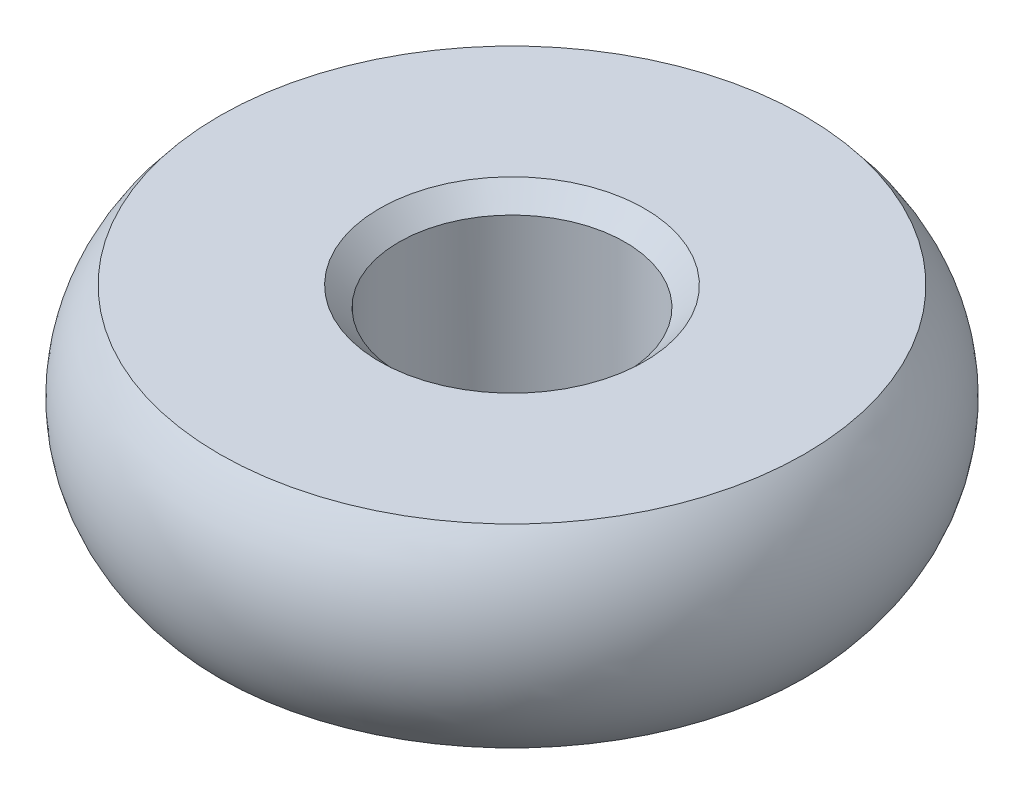
ISO-10303-21;
HEADER;
FILE_DESCRIPTION(('STEP AP214'),'2;1');
FILE_NAME('part.step','',(''),(''),'','','');
FILE_SCHEMA(('AUTOMOTIVE_DESIGN { 1 0 10303 214 1 1 1 1 }'));
ENDSEC;
DATA;
#1=APPLICATION_CONTEXT('core data for automotive mechanical design processes');
#2=APPLICATION_PROTOCOL_DEFINITION('international standard','automotive_design',2000,#1);
#3=PRODUCT_CONTEXT('',#1,'mechanical');
#4=PRODUCT('Part','Part','',(#3));
#5=PRODUCT_RELATED_PRODUCT_CATEGORY('part','',(#4));
#6=PRODUCT_DEFINITION_FORMATION('','',#4);
#7=PRODUCT_DEFINITION_CONTEXT('part definition',#1,'design');
#8=PRODUCT_DEFINITION('design','',#6,#7);
#9=PRODUCT_DEFINITION_SHAPE('','',#8);
#10=(LENGTH_UNIT() NAMED_UNIT(*) SI_UNIT(.MILLI.,.METRE.));
#11=(NAMED_UNIT(*) PLANE_ANGLE_UNIT() SI_UNIT($,.RADIAN.));
#12=(NAMED_UNIT(*) SI_UNIT($,.STERADIAN.) SOLID_ANGLE_UNIT());
#13=UNCERTAINTY_MEASURE_WITH_UNIT(LENGTH_MEASURE(1.E-05),#10,'distance_accuracy_value','');
#14=(GEOMETRIC_REPRESENTATION_CONTEXT(3) GLOBAL_UNCERTAINTY_ASSIGNED_CONTEXT((#13)) GLOBAL_UNIT_ASSIGNED_CONTEXT((#10,
#11,#12)) REPRESENTATION_CONTEXT('',''));
#15=CARTESIAN_POINT('',(0.,0.,0.));
#16=DIRECTION('',(0.,0.,1.));
#17=DIRECTION('',(1.,0.,0.));
#18=AXIS2_PLACEMENT_3D('',#15,#16,#17);
#19=CARTESIAN_POINT('',(17.5,14.9999999999999,0.));
#20=DIRECTION('',(0.,1.,0.));
#21=DIRECTION('',(-1.,0.,0.));
#22=AXIS2_PLACEMENT_3D('',#19,#20,#21);
#23=PLANE('',#22);
#24=CARTESIAN_POINT('',(0.,14.9999999999999,0.));
#25=DIRECTION('',(0.,1.,0.));
#26=DIRECTION('',(-1.,0.,0.));
#27=AXIS2_PLACEMENT_3D('',#24,#25,#26);
#28=CIRCLE('',#27,20.5000000000001);
#29=CARTESIAN_POINT('',(-20.5000000000002,14.9999999999998,0.));
#30=VERTEX_POINT('',#29);
#31=EDGE_CURVE('E48',#30,#30,#28,.F.);
#32=ORIENTED_EDGE('',*,*,#31,.T.);
#33=EDGE_LOOP('',(#32));
#34=FACE_BOUND('',#33,.T.);
#35=CARTESIAN_POINT('',(0.,14.9999999999999,0.));
#36=DIRECTION('',(0.,-1.,0.));
#37=DIRECTION('',(1.,0.,0.));
#38=AXIS2_PLACEMENT_3D('',#35,#36,#37);
#39=CIRCLE('',#38,45.2705098312485);
#40=CARTESIAN_POINT('',(45.2705098312484,15.0000000000001,0.));
#41=VERTEX_POINT('',#40);
#42=EDGE_CURVE('E53',#41,#41,#39,.T.);
#43=ORIENTED_EDGE('',*,*,#42,.F.);
#44=EDGE_LOOP('',(#43));
#45=FACE_BOUND('',#44,.T.);
#46=ADVANCED_FACE('F32',(#34,#45),#23,.T.);
#47=CARTESIAN_POINT('',(0.,-1.11022302462516E-13,0.));
#48=DIRECTION('',(0.,-1.,0.));
#49=DIRECTION('',(1.,0.,0.));
#50=AXIS2_PLACEMENT_3D('',#47,#48,#49);
#51=TOROIDAL_SURFACE('',#50,28.5,22.5);
#52=ORIENTED_EDGE('',*,*,#42,.T.);
#53=EDGE_LOOP('',(#52));
#54=FACE_BOUND('',#53,.T.);
#55=CARTESIAN_POINT('',(0.,-15.0000000000001,0.));
#56=DIRECTION('',(0.,-1.,0.));
#57=DIRECTION('',(1.,0.,0.));
#58=AXIS2_PLACEMENT_3D('',#55,#56,#57);
#59=CIRCLE('',#58,45.2705098312484);
#60=CARTESIAN_POINT('',(45.2705098312484,-15.,0.));
#61=VERTEX_POINT('',#60);
#62=EDGE_CURVE('E56',#61,#61,#59,.T.);
#63=ORIENTED_EDGE('',*,*,#62,.F.);
#64=EDGE_LOOP('',(#63));
#65=FACE_BOUND('',#64,.T.);
#66=ADVANCED_FACE('F62',(#54,#65),#51,.T.);
#67=CARTESIAN_POINT('',(17.5,-15.,0.));
#68=DIRECTION('',(0.,-1.,0.));
#69=DIRECTION('',(1.,0.,0.));
#70=AXIS2_PLACEMENT_3D('',#67,#68,#69);
#71=PLANE('',#70);
#72=CARTESIAN_POINT('',(0.,-15.0000000000001,0.));
#73=DIRECTION('',(0.,-1.,0.));
#74=DIRECTION('',(1.,0.,0.));
#75=AXIS2_PLACEMENT_3D('',#72,#73,#74);
#76=CIRCLE('',#75,20.4999999999999);
#77=CARTESIAN_POINT('',(20.5,-15.,0.));
#78=VERTEX_POINT('',#77);
#79=EDGE_CURVE('E10',#78,#78,#76,.F.);
#80=ORIENTED_EDGE('',*,*,#79,.T.);
#81=EDGE_LOOP('',(#80));
#82=FACE_BOUND('',#81,.T.);
#83=ORIENTED_EDGE('',*,*,#62,.T.);
#84=EDGE_LOOP('',(#83));
#85=FACE_BOUND('',#84,.T.);
#86=ADVANCED_FACE('F60',(#82,#85),#71,.T.);
#87=CARTESIAN_POINT('',(1.93062209184187E-12,-562.822725833894,0.));
#88=DIRECTION('',(0.,-1.,0.));
#89=DIRECTION('',(1.,0.,0.));
#90=AXIS2_PLACEMENT_3D('',#87,#88,#89);
#91=CYLINDRICAL_SURFACE('',#90,17.5);
#92=CARTESIAN_POINT('',(0.,11.9999999999998,0.));
#93=DIRECTION('',(0.,1.,0.));
#94=DIRECTION('',(-1.,0.,0.));
#95=AXIS2_PLACEMENT_3D('',#92,#93,#94);
#96=CIRCLE('',#95,17.5);
#97=CARTESIAN_POINT('',(-17.5,11.9999999999997,0.));
#98=VERTEX_POINT('',#97);
#99=EDGE_CURVE('E40',#98,#98,#96,.T.);
#100=ORIENTED_EDGE('',*,*,#99,.T.);
#101=EDGE_LOOP('',(#100));
#102=FACE_BOUND('',#101,.T.);
#103=CARTESIAN_POINT('',(0.,-12.0000000000002,0.));
#104=DIRECTION('',(0.,-1.,0.));
#105=DIRECTION('',(1.,0.,0.));
#106=AXIS2_PLACEMENT_3D('',#103,#104,#105);
#107=CIRCLE('',#106,17.5);
#108=CARTESIAN_POINT('',(17.5,-12.0000000000002,0.));
#109=VERTEX_POINT('',#108);
#110=EDGE_CURVE('E44',#109,#109,#107,.T.);
#111=ORIENTED_EDGE('',*,*,#110,.T.);
#112=EDGE_LOOP('',(#111));
#113=FACE_BOUND('',#112,.T.);
#114=ADVANCED_FACE('F70',(#102,#113),#91,.F.);
#115=CARTESIAN_POINT('',(0.,14.9999999999998,0.));
#116=DIRECTION('',(0.,1.,0.));
#117=DIRECTION('',(-1.,0.,0.));
#118=AXIS2_PLACEMENT_3D('',#115,#116,#117);
#119=CONICAL_SURFACE('',#118,20.5,0.78539816339745);
#120=ORIENTED_EDGE('',*,*,#99,.F.);
#121=EDGE_LOOP('',(#120));
#122=FACE_BOUND('',#121,.T.);
#123=ORIENTED_EDGE('',*,*,#31,.F.);
#124=EDGE_LOOP('',(#123));
#125=FACE_BOUND('',#124,.T.);
#126=ADVANCED_FACE('F76',(#122,#125),#119,.F.);
#127=CARTESIAN_POINT('',(0.,-12.0000000000002,0.));
#128=DIRECTION('',(0.,-1.,0.));
#129=DIRECTION('',(1.,0.,0.));
#130=AXIS2_PLACEMENT_3D('',#127,#128,#129);
#131=CONICAL_SURFACE('',#130,17.5,0.785398163397455);
#132=ORIENTED_EDGE('',*,*,#79,.F.);
#133=EDGE_LOOP('',(#132));
#134=FACE_BOUND('',#133,.T.);
#135=ORIENTED_EDGE('',*,*,#110,.F.);
#136=EDGE_LOOP('',(#135));
#137=FACE_BOUND('',#136,.T.);
#138=ADVANCED_FACE('F35',(#134,#137),#131,.F.);
#139=CLOSED_SHELL('',(#46,#66,#86,#114,#126,#138));
#140=MANIFOLD_SOLID_BREP('B2',#139);
#141=ADVANCED_BREP_SHAPE_REPRESENTATION('',(#18,#140),#14);
#142=SHAPE_DEFINITION_REPRESENTATION(#9,#141);
ENDSEC;
END-ISO-10303-21;
